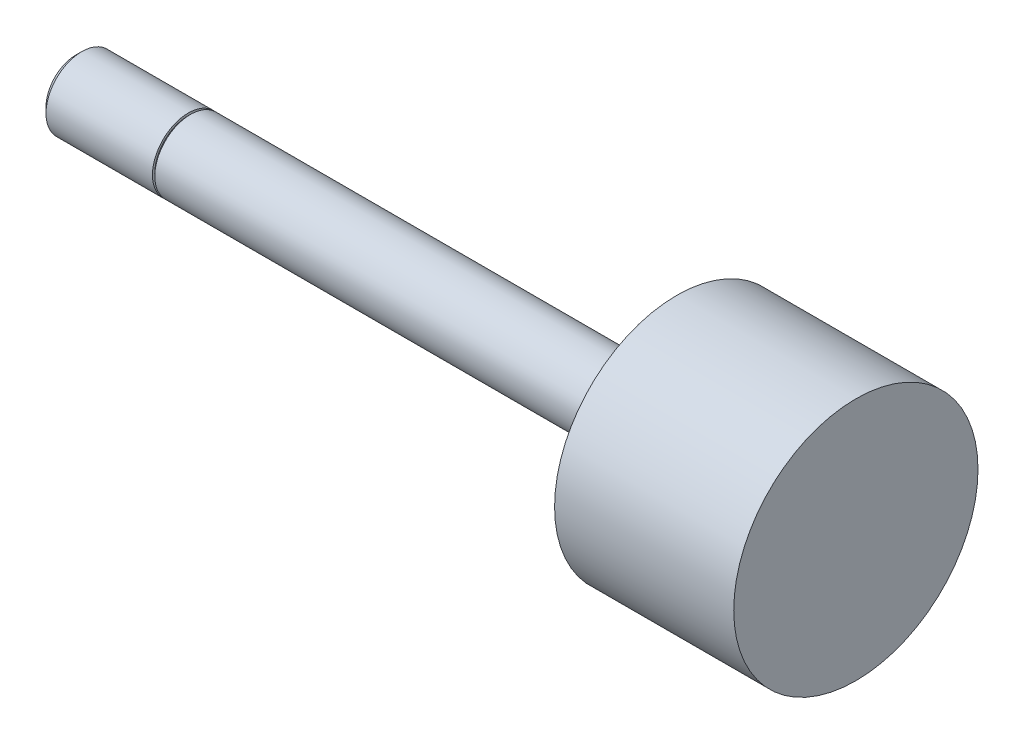
ISO-10303-21;
HEADER;
FILE_DESCRIPTION(('STEP AP214'),'2;1');
FILE_NAME('part.step','',(''),(''),'','','');
FILE_SCHEMA(('AUTOMOTIVE_DESIGN { 1 0 10303 214 1 1 1 1 }'));
ENDSEC;
DATA;
#1=APPLICATION_CONTEXT('core data for automotive mechanical design processes');
#2=APPLICATION_PROTOCOL_DEFINITION('international standard','automotive_design',2000,#1);
#3=PRODUCT_CONTEXT('',#1,'mechanical');
#4=PRODUCT('Part','Part','',(#3));
#5=PRODUCT_RELATED_PRODUCT_CATEGORY('part','',(#4));
#6=PRODUCT_DEFINITION_FORMATION('','',#4);
#7=PRODUCT_DEFINITION_CONTEXT('part definition',#1,'design');
#8=PRODUCT_DEFINITION('design','',#6,#7);
#9=PRODUCT_DEFINITION_SHAPE('','',#8);
#10=(LENGTH_UNIT() NAMED_UNIT(*) SI_UNIT(.MILLI.,.METRE.));
#11=(NAMED_UNIT(*) PLANE_ANGLE_UNIT() SI_UNIT($,.RADIAN.));
#12=(NAMED_UNIT(*) SI_UNIT($,.STERADIAN.) SOLID_ANGLE_UNIT());
#13=UNCERTAINTY_MEASURE_WITH_UNIT(LENGTH_MEASURE(1.E-05),#10,'distance_accuracy_value','');
#14=(GEOMETRIC_REPRESENTATION_CONTEXT(3) GLOBAL_UNCERTAINTY_ASSIGNED_CONTEXT((#13)) GLOBAL_UNIT_ASSIGNED_CONTEXT((#10,
#11,#12)) REPRESENTATION_CONTEXT('',''));
#15=CARTESIAN_POINT('',(0.,0.,0.));
#16=DIRECTION('',(0.,0.,1.));
#17=DIRECTION('',(1.,0.,0.));
#18=AXIS2_PLACEMENT_3D('',#15,#16,#17);
#19=CARTESIAN_POINT('',(-12.7,0.,0.));
#20=DIRECTION('',(1.,0.,0.));
#21=DIRECTION('',(0.,0.,-1.));
#22=AXIS2_PLACEMENT_3D('',#19,#20,#21);
#23=PLANE('',#22);
#24=CARTESIAN_POINT('',(-12.7000000000521,0.,0.));
#25=DIRECTION('',(1.,0.,0.));
#26=DIRECTION('',(0.,1.,0.));
#27=AXIS2_PLACEMENT_3D('',#24,#25,#26);
#28=CIRCLE('',#27,3.33882999996149);
#29=CARTESIAN_POINT('',(-12.7000000000521,3.33882999996149,0.));
#30=VERTEX_POINT('',#29);
#31=EDGE_CURVE('E17',#30,#30,#28,.T.);
#32=ORIENTED_EDGE('',*,*,#31,.F.);
#33=EDGE_LOOP('',(#32));
#34=FACE_BOUND('',#33,.T.);
#35=ADVANCED_FACE('F14',(#34),#23,.F.);
#36=CARTESIAN_POINT('',(-12.0700800000009,0.,0.));
#37=DIRECTION('',(1.,0.,0.));
#38=DIRECTION('',(0.,1.,0.));
#39=AXIS2_PLACEMENT_3D('',#36,#37,#38);
#40=CONICAL_SURFACE('',#39,3.96875000001273,0.785398163397448);
#41=ORIENTED_EDGE('',*,*,#31,.T.);
#42=EDGE_LOOP('',(#41));
#43=FACE_BOUND('',#42,.T.);
#44=CARTESIAN_POINT('',(-12.07008,0.,0.));
#45=DIRECTION('',(-1.,0.,0.));
#46=DIRECTION('',(0.,0.,1.));
#47=AXIS2_PLACEMENT_3D('',#44,#45,#46);
#48=CIRCLE('',#47,3.96875);
#49=CARTESIAN_POINT('',(-12.07008,0.,3.96875));
#50=VERTEX_POINT('',#49);
#51=EDGE_CURVE('E44',#50,#50,#48,.F.);
#52=ORIENTED_EDGE('',*,*,#51,.F.);
#53=EDGE_LOOP('',(#52));
#54=FACE_BOUND('',#53,.T.);
#55=ADVANCED_FACE('F53',(#43,#54),#40,.T.);
#56=CARTESIAN_POINT('',(0.,0.,0.));
#57=DIRECTION('',(-1.,0.,0.));
#58=DIRECTION('',(0.,0.,1.));
#59=AXIS2_PLACEMENT_3D('',#56,#57,#58);
#60=CYLINDRICAL_SURFACE('',#59,3.96875);
#61=ORIENTED_EDGE('',*,*,#51,.T.);
#62=EDGE_LOOP('',(#61));
#63=FACE_BOUND('',#62,.T.);
#64=CARTESIAN_POINT('',(-0.254,0.,0.));
#65=DIRECTION('',(-1.,0.,0.));
#66=DIRECTION('',(0.,0.,1.));
#67=AXIS2_PLACEMENT_3D('',#64,#65,#66);
#68=CIRCLE('',#67,3.96875);
#69=CARTESIAN_POINT('',(-0.254,0.,3.96875));
#70=VERTEX_POINT('',#69);
#71=EDGE_CURVE('E42',#70,#70,#68,.T.);
#72=ORIENTED_EDGE('',*,*,#71,.T.);
#73=EDGE_LOOP('',(#72));
#74=FACE_BOUND('',#73,.T.);
#75=ADVANCED_FACE('F61',(#63,#74),#60,.T.);
#76=CARTESIAN_POINT('',(-0.254,4.22275,0.));
#77=DIRECTION('',(-1.,0.,0.));
#78=DIRECTION('',(0.,0.,1.));
#79=AXIS2_PLACEMENT_3D('',#76,#77,#78);
#80=PLANE('',#79);
#81=ORIENTED_EDGE('',*,*,#71,.F.);
#82=EDGE_LOOP('',(#81));
#83=FACE_BOUND('',#82,.T.);
#84=CARTESIAN_POINT('',(-0.254,0.,0.));
#85=DIRECTION('',(-1.,0.,0.));
#86=DIRECTION('',(0.,0.,1.));
#87=AXIS2_PLACEMENT_3D('',#84,#85,#86);
#88=CIRCLE('',#87,3.71475);
#89=CARTESIAN_POINT('',(-0.254,0.,3.71475));
#90=VERTEX_POINT('',#89);
#91=EDGE_CURVE('E40',#90,#90,#88,.F.);
#92=ORIENTED_EDGE('',*,*,#91,.F.);
#93=EDGE_LOOP('',(#92));
#94=FACE_BOUND('',#93,.T.);
#95=ADVANCED_FACE('F88',(#83,#94),#80,.F.);
#96=CARTESIAN_POINT('',(0.,0.,0.));
#97=DIRECTION('',(-1.,0.,0.));
#98=DIRECTION('',(0.,0.,1.));
#99=AXIS2_PLACEMENT_3D('',#96,#97,#98);
#100=CYLINDRICAL_SURFACE('',#99,3.71475);
#101=ORIENTED_EDGE('',*,*,#91,.T.);
#102=EDGE_LOOP('',(#101));
#103=FACE_BOUND('',#102,.T.);
#104=CARTESIAN_POINT('',(0.,0.,0.));
#105=DIRECTION('',(-1.,0.,0.));
#106=DIRECTION('',(0.,0.,1.));
#107=AXIS2_PLACEMENT_3D('',#104,#105,#106);
#108=CIRCLE('',#107,3.71475);
#109=CARTESIAN_POINT('',(0.,0.,3.71475));
#110=VERTEX_POINT('',#109);
#111=EDGE_CURVE('E37',#110,#110,#108,.T.);
#112=ORIENTED_EDGE('',*,*,#111,.T.);
#113=EDGE_LOOP('',(#112));
#114=FACE_BOUND('',#113,.T.);
#115=ADVANCED_FACE('F84',(#103,#114),#100,.T.);
#116=CARTESIAN_POINT('',(0.,3.71475,0.));
#117=DIRECTION('',(1.,0.,0.));
#118=DIRECTION('',(0.,0.,-1.));
#119=AXIS2_PLACEMENT_3D('',#116,#117,#118);
#120=PLANE('',#119);
#121=ORIENTED_EDGE('',*,*,#111,.F.);
#122=EDGE_LOOP('',(#121));
#123=FACE_BOUND('',#122,.T.);
#124=CARTESIAN_POINT('',(0.,0.,0.));
#125=DIRECTION('',(-1.,0.,0.));
#126=DIRECTION('',(0.,0.,1.));
#127=AXIS2_PLACEMENT_3D('',#124,#125,#126);
#128=CIRCLE('',#127,3.9624);
#129=CARTESIAN_POINT('',(0.,0.,3.9624));
#130=VERTEX_POINT('',#129);
#131=EDGE_CURVE('E34',#130,#130,#128,.F.);
#132=ORIENTED_EDGE('',*,*,#131,.F.);
#133=EDGE_LOOP('',(#132));
#134=FACE_BOUND('',#133,.T.);
#135=ADVANCED_FACE('F80',(#123,#134),#120,.F.);
#136=CARTESIAN_POINT('',(73.8632,0.,0.));
#137=DIRECTION('',(-1.,0.,0.));
#138=DIRECTION('',(0.,0.,1.));
#139=AXIS2_PLACEMENT_3D('',#136,#137,#138);
#140=CYLINDRICAL_SURFACE('',#139,3.9624);
#141=ORIENTED_EDGE('',*,*,#131,.T.);
#142=EDGE_LOOP('',(#141));
#143=FACE_BOUND('',#142,.T.);
#144=CARTESIAN_POINT('',(53.975,0.,0.));
#145=DIRECTION('',(-1.,0.,0.));
#146=DIRECTION('',(0.,0.,1.));
#147=AXIS2_PLACEMENT_3D('',#144,#145,#146);
#148=CIRCLE('',#147,3.9624);
#149=CARTESIAN_POINT('',(53.975,0.,3.9624));
#150=VERTEX_POINT('',#149);
#151=EDGE_CURVE('E26',#150,#150,#148,.T.);
#152=ORIENTED_EDGE('',*,*,#151,.T.);
#153=EDGE_LOOP('',(#152));
#154=FACE_BOUND('',#153,.T.);
#155=ADVANCED_FACE('F76',(#143,#154),#140,.T.);
#156=CARTESIAN_POINT('',(73.8632,13.55725,0.));
#157=DIRECTION('',(-1.,0.,0.));
#158=DIRECTION('',(0.,0.,1.));
#159=AXIS2_PLACEMENT_3D('',#156,#157,#158);
#160=PLANE('',#159);
#161=CARTESIAN_POINT('',(73.8632,0.,0.));
#162=DIRECTION('',(-1.,0.,0.));
#163=DIRECTION('',(0.,0.,1.));
#164=AXIS2_PLACEMENT_3D('',#161,#162,#163);
#165=CIRCLE('',#164,13.55725);
#166=CARTESIAN_POINT('',(73.8632,0.,13.55725));
#167=VERTEX_POINT('',#166);
#168=EDGE_CURVE('E21',#167,#167,#165,.T.);
#169=ORIENTED_EDGE('',*,*,#168,.F.);
#170=EDGE_LOOP('',(#169));
#171=FACE_BOUND('',#170,.T.);
#172=ADVANCED_FACE('F69',(#171),#160,.F.);
#173=CARTESIAN_POINT('',(53.975,3.9624,0.));
#174=DIRECTION('',(1.,0.,0.));
#175=DIRECTION('',(0.,0.,-1.));
#176=AXIS2_PLACEMENT_3D('',#173,#174,#175);
#177=PLANE('',#176);
#178=ORIENTED_EDGE('',*,*,#151,.F.);
#179=EDGE_LOOP('',(#178));
#180=FACE_BOUND('',#179,.T.);
#181=CARTESIAN_POINT('',(53.975,0.,0.));
#182=DIRECTION('',(-1.,0.,0.));
#183=DIRECTION('',(0.,0.,1.));
#184=AXIS2_PLACEMENT_3D('',#181,#182,#183);
#185=CIRCLE('',#184,13.55725);
#186=CARTESIAN_POINT('',(53.975,0.,13.55725));
#187=VERTEX_POINT('',#186);
#188=EDGE_CURVE('E9',#187,#187,#185,.F.);
#189=ORIENTED_EDGE('',*,*,#188,.F.);
#190=EDGE_LOOP('',(#189));
#191=FACE_BOUND('',#190,.T.);
#192=ADVANCED_FACE('F64',(#180,#191),#177,.F.);
#193=CARTESIAN_POINT('',(73.8632,0.,0.));
#194=DIRECTION('',(-1.,0.,0.));
#195=DIRECTION('',(0.,0.,1.));
#196=AXIS2_PLACEMENT_3D('',#193,#194,#195);
#197=CYLINDRICAL_SURFACE('',#196,13.55725);
#198=ORIENTED_EDGE('',*,*,#188,.T.);
#199=EDGE_LOOP('',(#198));
#200=FACE_BOUND('',#199,.T.);
#201=ORIENTED_EDGE('',*,*,#168,.T.);
#202=EDGE_LOOP('',(#201));
#203=FACE_BOUND('',#202,.T.);
#204=ADVANCED_FACE('F62',(#200,#203),#197,.T.);
#205=CLOSED_SHELL('',(#35,#55,#75,#95,#115,#135,#155,#172,#192,#204));
#206=MANIFOLD_SOLID_BREP('B1',#205);
#207=ADVANCED_BREP_SHAPE_REPRESENTATION('',(#18,#206),#14);
#208=SHAPE_DEFINITION_REPRESENTATION(#9,#207);
ENDSEC;
END-ISO-10303-21;
